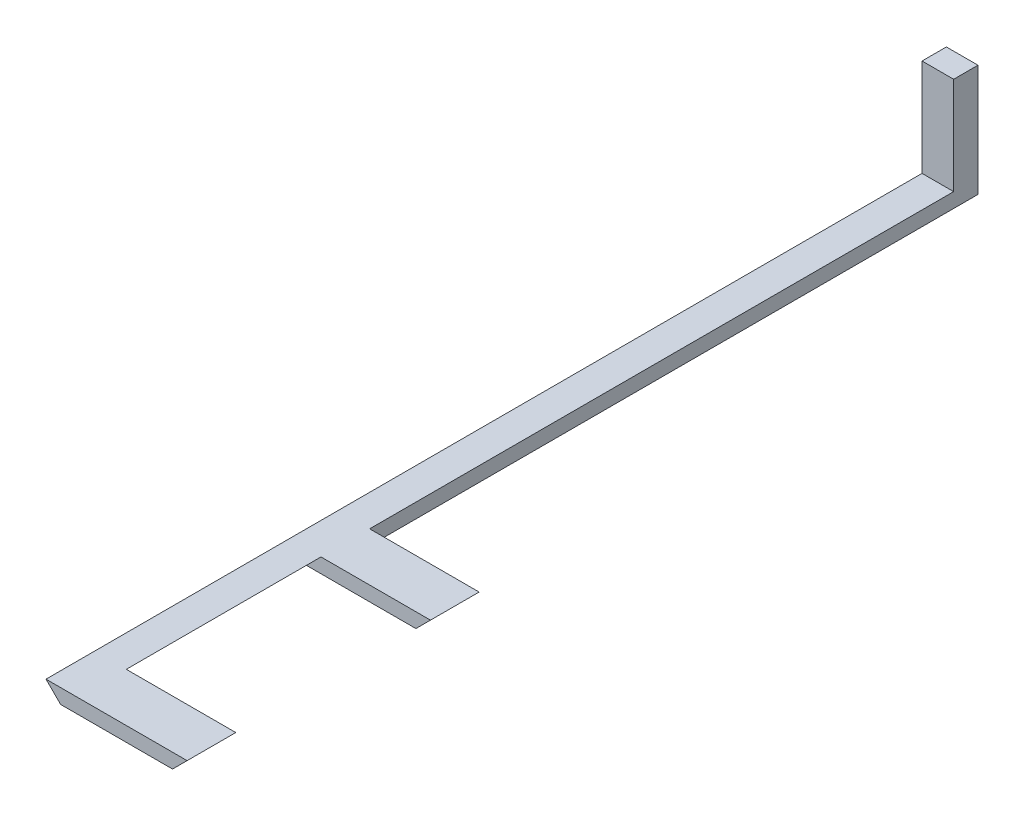
ISO-10303-21;
HEADER;
FILE_DESCRIPTION(('STEP AP214'),'2;1');
FILE_NAME('part.step','',(''),(''),'','','');
FILE_SCHEMA(('AUTOMOTIVE_DESIGN { 1 0 10303 214 1 1 1 1 }'));
ENDSEC;
DATA;
#1=APPLICATION_CONTEXT('core data for automotive mechanical design processes');
#2=APPLICATION_PROTOCOL_DEFINITION('international standard','automotive_design',2000,#1);
#3=PRODUCT_CONTEXT('',#1,'mechanical');
#4=PRODUCT('Part','Part','',(#3));
#5=PRODUCT_RELATED_PRODUCT_CATEGORY('part','',(#4));
#6=PRODUCT_DEFINITION_FORMATION('','',#4);
#7=PRODUCT_DEFINITION_CONTEXT('part definition',#1,'design');
#8=PRODUCT_DEFINITION('design','',#6,#7);
#9=PRODUCT_DEFINITION_SHAPE('','',#8);
#10=(LENGTH_UNIT() NAMED_UNIT(*) SI_UNIT(.MILLI.,.METRE.));
#11=(NAMED_UNIT(*) PLANE_ANGLE_UNIT() SI_UNIT($,.RADIAN.));
#12=(NAMED_UNIT(*) SI_UNIT($,.STERADIAN.) SOLID_ANGLE_UNIT());
#13=UNCERTAINTY_MEASURE_WITH_UNIT(LENGTH_MEASURE(1.E-05),#10,'distance_accuracy_value','');
#14=(GEOMETRIC_REPRESENTATION_CONTEXT(3) GLOBAL_UNCERTAINTY_ASSIGNED_CONTEXT((#13)) GLOBAL_UNIT_ASSIGNED_CONTEXT((#10,
#11,#12)) REPRESENTATION_CONTEXT('',''));
#15=CARTESIAN_POINT('',(0.,0.,0.));
#16=DIRECTION('',(0.,0.,1.));
#17=DIRECTION('',(1.,0.,0.));
#18=AXIS2_PLACEMENT_3D('',#15,#16,#17);
#19=CARTESIAN_POINT('',(0.,3.,0.));
#20=DIRECTION('',(0.,0.,-1.));
#21=DIRECTION('',(-1.,0.,0.));
#22=AXIS2_PLACEMENT_3D('',#19,#20,#21);
#23=PLANE('',#22);
#24=DIRECTION('',(1.,0.,0.));
#25=VECTOR('',#24,1.);
#26=CARTESIAN_POINT('',(0.,3.,0.));
#27=LINE('',#26,#25);
#28=CARTESIAN_POINT('',(-6.49999999999999,3.,0.));
#29=VERTEX_POINT('',#28);
#30=CARTESIAN_POINT('',(22.5,3.,0.));
#31=VERTEX_POINT('',#30);
#32=EDGE_CURVE('E175',#29,#31,#27,.T.);
#33=ORIENTED_EDGE('',*,*,#32,.F.);
#34=DIRECTION('',(-0.707106781186548,0.707106781186548,0.));
#35=VECTOR('',#34,1.);
#36=CARTESIAN_POINT('',(-6.49999999999991,2.99999999999992,0.));
#37=LINE('',#36,#35);
#38=CARTESIAN_POINT('',(-3.49999999999999,0.,0.));
#39=VERTEX_POINT('',#38);
#40=EDGE_CURVE('E240',#29,#39,#37,.F.);
#41=ORIENTED_EDGE('',*,*,#40,.T.);
#42=DIRECTION('',(1.,0.,0.));
#43=VECTOR('',#42,1.);
#44=CARTESIAN_POINT('',(0.,0.,0.));
#45=LINE('',#44,#43);
#46=CARTESIAN_POINT('',(19.5,0.,0.));
#47=VERTEX_POINT('',#46);
#48=EDGE_CURVE('E168',#39,#47,#45,.T.);
#49=ORIENTED_EDGE('',*,*,#48,.T.);
#50=DIRECTION('',(-0.707106781186548,-0.707106781186548,0.));
#51=VECTOR('',#50,1.);
#52=CARTESIAN_POINT('',(22.5,3.,0.));
#53=LINE('',#52,#51);
#54=EDGE_CURVE('E233',#47,#31,#53,.F.);
#55=ORIENTED_EDGE('',*,*,#54,.T.);
#56=EDGE_LOOP('',(#33,#41,#49,#55));
#57=FACE_BOUND('',#56,.T.);
#58=ADVANCED_FACE('F47',(#57),#23,.F.);
#59=CARTESIAN_POINT('',(0.,3.,-10.));
#60=DIRECTION('',(0.,0.,1.));
#61=DIRECTION('',(1.,0.,0.));
#62=AXIS2_PLACEMENT_3D('',#59,#60,#61);
#63=PLANE('',#62);
#64=DIRECTION('',(-1.,0.,0.));
#65=VECTOR('',#64,1.);
#66=CARTESIAN_POINT('',(0.,3.,-10.));
#67=LINE('',#66,#65);
#68=CARTESIAN_POINT('',(22.5,3.,-10.));
#69=VERTEX_POINT('',#68);
#70=CARTESIAN_POINT('',(0.,3.,-10.));
#71=VERTEX_POINT('',#70);
#72=EDGE_CURVE('E181',#69,#71,#67,.T.);
#73=ORIENTED_EDGE('',*,*,#72,.F.);
#74=DIRECTION('',(0.707106781186548,0.707106781186548,0.));
#75=VECTOR('',#74,1.);
#76=CARTESIAN_POINT('',(22.5,3.,-10.));
#77=LINE('',#76,#75);
#78=CARTESIAN_POINT('',(19.5,0.,-10.));
#79=VERTEX_POINT('',#78);
#80=EDGE_CURVE('E231',#69,#79,#77,.F.);
#81=ORIENTED_EDGE('',*,*,#80,.T.);
#82=DIRECTION('',(-1.,0.,0.));
#83=VECTOR('',#82,1.);
#84=CARTESIAN_POINT('',(0.,0.,-10.));
#85=LINE('',#84,#83);
#86=CARTESIAN_POINT('',(-3.,0.,-10.));
#87=VERTEX_POINT('',#86);
#88=EDGE_CURVE('E170',#79,#87,#85,.T.);
#89=ORIENTED_EDGE('',*,*,#88,.T.);
#90=DIRECTION('',(-0.707106781186548,-0.707106781186548,0.));
#91=VECTOR('',#90,1.);
#92=CARTESIAN_POINT('',(0.,3.,-10.));
#93=LINE('',#92,#91);
#94=EDGE_CURVE('E238',#87,#71,#93,.F.);
#95=ORIENTED_EDGE('',*,*,#94,.T.);
#96=EDGE_LOOP('',(#73,#81,#89,#95));
#97=FACE_BOUND('',#96,.T.);
#98=ADVANCED_FACE('F268',(#97),#63,.F.);
#99=CARTESIAN_POINT('',(-1.71512449944288E-13,3.,-50.));
#100=DIRECTION('',(0.,0.,-1.));
#101=DIRECTION('',(-1.,0.,0.));
#102=AXIS2_PLACEMENT_3D('',#99,#100,#101);
#103=PLANE('',#102);
#104=DIRECTION('',(1.,0.,0.));
#105=VECTOR('',#104,1.);
#106=CARTESIAN_POINT('',(-1.71512449944288E-13,0.,-50.));
#107=LINE('',#106,#105);
#108=CARTESIAN_POINT('',(-3.00000000000017,0.,-50.));
#109=VERTEX_POINT('',#108);
#110=CARTESIAN_POINT('',(19.4999999999998,0.,-50.));
#111=VERTEX_POINT('',#110);
#112=EDGE_CURVE('E201',#109,#111,#107,.T.);
#113=ORIENTED_EDGE('',*,*,#112,.T.);
#114=DIRECTION('',(-0.707106781186548,-0.707106781186548,0.));
#115=VECTOR('',#114,1.);
#116=CARTESIAN_POINT('',(22.4999999999998,3.,-50.));
#117=LINE('',#116,#115);
#118=CARTESIAN_POINT('',(22.4999999999998,3.,-50.));
#119=VERTEX_POINT('',#118);
#120=EDGE_CURVE('E229',#111,#119,#117,.F.);
#121=ORIENTED_EDGE('',*,*,#120,.T.);
#122=DIRECTION('',(1.,0.,0.));
#123=VECTOR('',#122,1.);
#124=CARTESIAN_POINT('',(-1.71512449944288E-13,3.,-50.));
#125=LINE('',#124,#123);
#126=CARTESIAN_POINT('',(-1.71512449944288E-13,3.,-50.));
#127=VERTEX_POINT('',#126);
#128=EDGE_CURVE('E187',#127,#119,#125,.T.);
#129=ORIENTED_EDGE('',*,*,#128,.F.);
#130=DIRECTION('',(0.707106781186548,0.707106781186548,0.));
#131=VECTOR('',#130,1.);
#132=CARTESIAN_POINT('',(-1.72813492551271E-13,3.,-50.));
#133=LINE('',#132,#131);
#134=EDGE_CURVE('E235',#127,#109,#133,.F.);
#135=ORIENTED_EDGE('',*,*,#134,.T.);
#136=EDGE_LOOP('',(#113,#121,#129,#135));
#137=FACE_BOUND('',#136,.T.);
#138=ADVANCED_FACE('F277',(#137),#103,.F.);
#139=CARTESIAN_POINT('',(-1.71512449944288E-13,3.,-60.));
#140=DIRECTION('',(0.,0.,1.));
#141=DIRECTION('',(1.,0.,0.));
#142=AXIS2_PLACEMENT_3D('',#139,#140,#141);
#143=PLANE('',#142);
#144=DIRECTION('',(-1.,0.,0.));
#145=VECTOR('',#144,1.);
#146=CARTESIAN_POINT('',(-1.71512449944288E-13,3.,-60.));
#147=LINE('',#146,#145);
#148=CARTESIAN_POINT('',(22.4999999999998,3.,-60.));
#149=VERTEX_POINT('',#148);
#150=CARTESIAN_POINT('',(-1.71512449944288E-13,3.,-60.));
#151=VERTEX_POINT('',#150);
#152=EDGE_CURVE('E193',#149,#151,#147,.T.);
#153=ORIENTED_EDGE('',*,*,#152,.F.);
#154=DIRECTION('',(0.707106781186548,0.707106781186548,0.));
#155=VECTOR('',#154,1.);
#156=CARTESIAN_POINT('',(22.4999999999998,3.,-60.));
#157=LINE('',#156,#155);
#158=CARTESIAN_POINT('',(19.4999999999998,0.,-60.));
#159=VERTEX_POINT('',#158);
#160=EDGE_CURVE('E227',#149,#159,#157,.F.);
#161=ORIENTED_EDGE('',*,*,#160,.T.);
#162=DIRECTION('',(-1.,0.,0.));
#163=VECTOR('',#162,1.);
#164=CARTESIAN_POINT('',(-1.71512449944288E-13,0.,-60.));
#165=LINE('',#164,#163);
#166=CARTESIAN_POINT('',(-1.71512449944288E-13,0.,-60.));
#167=VERTEX_POINT('',#166);
#168=EDGE_CURVE('E204',#159,#167,#165,.T.);
#169=ORIENTED_EDGE('',*,*,#168,.T.);
#170=DIRECTION('',(0.,-1.,0.));
#171=VECTOR('',#170,1.);
#172=CARTESIAN_POINT('',(-1.71512449944288E-13,3.,-60.));
#173=LINE('',#172,#171);
#174=EDGE_CURVE('E216',#151,#167,#173,.T.);
#175=ORIENTED_EDGE('',*,*,#174,.F.);
#176=EDGE_LOOP('',(#153,#161,#169,#175));
#177=FACE_BOUND('',#176,.T.);
#178=ADVANCED_FACE('F285',(#177),#143,.F.);
#179=CARTESIAN_POINT('',(-1.71512449944288E-13,3.,-60.));
#180=DIRECTION('',(-1.,0.,0.));
#181=DIRECTION('',(0.,0.,1.));
#182=AXIS2_PLACEMENT_3D('',#179,#180,#181);
#183=PLANE('',#182);
#184=DIRECTION('',(0.,0.,-1.));
#185=VECTOR('',#184,1.);
#186=CARTESIAN_POINT('',(-1.71512449944288E-13,0.,-60.));
#187=LINE('',#186,#185);
#188=CARTESIAN_POINT('',(-1.66613862747699E-13,0.,-185.));
#189=VERTEX_POINT('',#188);
#190=EDGE_CURVE('E206',#167,#189,#187,.T.);
#191=ORIENTED_EDGE('',*,*,#190,.T.);
#192=DIRECTION('',(0.,-1.,0.));
#193=VECTOR('',#192,1.);
#194=CARTESIAN_POINT('',(-1.66613862747699E-13,3.,-185.));
#195=LINE('',#194,#193);
#196=CARTESIAN_POINT('',(-1.72604985859692E-13,23.,-185.));
#197=VERTEX_POINT('',#196);
#198=EDGE_CURVE('E213',#197,#189,#195,.T.);
#199=ORIENTED_EDGE('',*,*,#198,.F.);
#200=DIRECTION('',(0.,0.,-1.));
#201=VECTOR('',#200,1.);
#202=CARTESIAN_POINT('',(-1.72604985859692E-13,23.,-185.));
#203=LINE('',#202,#201);
#204=CARTESIAN_POINT('',(-1.72604985859692E-13,23.,-180.));
#205=VERTEX_POINT('',#204);
#206=EDGE_CURVE('E157',#205,#197,#203,.T.);
#207=ORIENTED_EDGE('',*,*,#206,.F.);
#208=DIRECTION('',(0.,-1.,0.));
#209=VECTOR('',#208,1.);
#210=CARTESIAN_POINT('',(-1.72604985859692E-13,23.,-180.));
#211=LINE('',#210,#209);
#212=CARTESIAN_POINT('',(-1.72604985859692E-13,3.,-180.));
#213=VERTEX_POINT('',#212);
#214=EDGE_CURVE('E153',#205,#213,#211,.T.);
#215=ORIENTED_EDGE('',*,*,#214,.T.);
#216=DIRECTION('',(0.,0.,-1.));
#217=VECTOR('',#216,1.);
#218=CARTESIAN_POINT('',(-1.71512449944288E-13,3.,-60.));
#219=LINE('',#218,#217);
#220=EDGE_CURVE('E195',#151,#213,#219,.T.);
#221=ORIENTED_EDGE('',*,*,#220,.F.);
#222=ORIENTED_EDGE('',*,*,#174,.T.);
#223=EDGE_LOOP('',(#191,#199,#207,#215,#221,#222));
#224=FACE_BOUND('',#223,.T.);
#225=ADVANCED_FACE('F290',(#224),#183,.F.);
#226=CARTESIAN_POINT('',(-6.49999999999987,3.,-185.));
#227=DIRECTION('',(0.,0.,1.));
#228=DIRECTION('',(1.,0.,0.));
#229=AXIS2_PLACEMENT_3D('',#226,#227,#228);
#230=PLANE('',#229);
#231=DIRECTION('',(-1.,0.,0.));
#232=VECTOR('',#231,1.);
#233=CARTESIAN_POINT('',(-6.49999999999987,0.,-185.));
#234=LINE('',#233,#232);
#235=CARTESIAN_POINT('',(-6.49999999999987,0.,-185.));
#236=VERTEX_POINT('',#235);
#237=EDGE_CURVE('E208',#189,#236,#234,.T.);
#238=ORIENTED_EDGE('',*,*,#237,.T.);
#239=DIRECTION('',(0.,-1.,0.));
#240=VECTOR('',#239,1.);
#241=CARTESIAN_POINT('',(-6.49999999999987,3.,-185.));
#242=LINE('',#241,#240);
#243=CARTESIAN_POINT('',(-6.49999999999987,23.,-185.));
#244=VERTEX_POINT('',#243);
#245=EDGE_CURVE('E198',#244,#236,#242,.T.);
#246=ORIENTED_EDGE('',*,*,#245,.F.);
#247=DIRECTION('',(-1.,0.,0.));
#248=VECTOR('',#247,1.);
#249=CARTESIAN_POINT('',(-6.49999999999987,23.,-185.));
#250=LINE('',#249,#248);
#251=EDGE_CURVE('E164',#197,#244,#250,.T.);
#252=ORIENTED_EDGE('',*,*,#251,.F.);
#253=ORIENTED_EDGE('',*,*,#198,.T.);
#254=EDGE_LOOP('',(#238,#246,#252,#253));
#255=FACE_BOUND('',#254,.T.);
#256=ADVANCED_FACE('F294',(#255),#230,.F.);
#257=CARTESIAN_POINT('',(-6.49999999999983,3.,-60.));
#258=DIRECTION('',(1.,0.,0.));
#259=DIRECTION('',(0.,0.,-1.));
#260=AXIS2_PLACEMENT_3D('',#257,#258,#259);
#261=PLANE('',#260);
#262=DIRECTION('',(0.,0.,1.));
#263=VECTOR('',#262,1.);
#264=CARTESIAN_POINT('',(-6.49999999999983,0.,-60.));
#265=LINE('',#264,#263);
#266=CARTESIAN_POINT('',(-6.49999999999986,0.,-49.1213203435595));
#267=VERTEX_POINT('',#266);
#268=EDGE_CURVE('E63',#236,#267,#265,.T.);
#269=ORIENTED_EDGE('',*,*,#268,.T.);
#270=DIRECTION('',(0.,0.816496580927728,0.577350269189623));
#271=VECTOR('',#270,1.);
#272=CARTESIAN_POINT('',(-6.49999999999986,-3.12825877028344,-51.3333333333332));
#273=LINE('',#272,#271);
#274=CARTESIAN_POINT('',(-6.49999999999983,3.,-46.9999999999999));
#275=VERTEX_POINT('',#274);
#276=EDGE_CURVE('E56',#267,#275,#273,.T.);
#277=ORIENTED_EDGE('',*,*,#276,.T.);
#278=DIRECTION('',(0.,0.,1.));
#279=VECTOR('',#278,1.);
#280=CARTESIAN_POINT('',(-6.49999999999983,3.,-60.));
#281=LINE('',#280,#279);
#282=CARTESIAN_POINT('',(-6.49999999999987,3.,-180.));
#283=VERTEX_POINT('',#282);
#284=EDGE_CURVE('E70',#283,#275,#281,.T.);
#285=ORIENTED_EDGE('',*,*,#284,.F.);
#286=DIRECTION('',(0.,-1.,0.));
#287=VECTOR('',#286,1.);
#288=CARTESIAN_POINT('',(-6.49999999999987,23.,-180.));
#289=LINE('',#288,#287);
#290=CARTESIAN_POINT('',(-6.49999999999987,23.,-180.));
#291=VERTEX_POINT('',#290);
#292=EDGE_CURVE('E151',#291,#283,#289,.T.);
#293=ORIENTED_EDGE('',*,*,#292,.F.);
#294=DIRECTION('',(0.,0.,1.));
#295=VECTOR('',#294,1.);
#296=CARTESIAN_POINT('',(-6.49999999999987,23.,-185.));
#297=LINE('',#296,#295);
#298=EDGE_CURVE('E158',#244,#291,#297,.T.);
#299=ORIENTED_EDGE('',*,*,#298,.F.);
#300=ORIENTED_EDGE('',*,*,#245,.T.);
#301=EDGE_LOOP('',(#269,#277,#285,#293,#299,#300));
#302=FACE_BOUND('',#301,.T.);
#303=ADVANCED_FACE('F167',(#302),#261,.F.);
#304=CARTESIAN_POINT('',(0.,3.,0.));
#305=DIRECTION('',(0.,1.,0.));
#306=DIRECTION('',(0.,0.,1.));
#307=AXIS2_PLACEMENT_3D('',#304,#305,#306);
#308=PLANE('',#307);
#309=DIRECTION('',(1.,0.,0.));
#310=VECTOR('',#309,1.);
#311=CARTESIAN_POINT('',(-6.49999999999987,3.,-180.));
#312=LINE('',#311,#310);
#313=EDGE_CURVE('E165',#283,#213,#312,.T.);
#314=ORIENTED_EDGE('',*,*,#313,.F.);
#315=ORIENTED_EDGE('',*,*,#284,.T.);
#316=EDGE_CURVE('E197',#275,#29,#281,.T.);
#317=ORIENTED_EDGE('',*,*,#316,.T.);
#318=ORIENTED_EDGE('',*,*,#32,.T.);
#319=DIRECTION('',(0.,0.,-1.));
#320=VECTOR('',#319,1.);
#321=CARTESIAN_POINT('',(22.5,3.,0.));
#322=LINE('',#321,#320);
#323=EDGE_CURVE('E178',#31,#69,#322,.T.);
#324=ORIENTED_EDGE('',*,*,#323,.T.);
#325=ORIENTED_EDGE('',*,*,#72,.T.);
#326=DIRECTION('',(0.,0.,-1.));
#327=VECTOR('',#326,1.);
#328=CARTESIAN_POINT('',(-1.71512449944288E-13,3.,-50.));
#329=LINE('',#328,#327);
#330=EDGE_CURVE('E184',#71,#127,#329,.T.);
#331=ORIENTED_EDGE('',*,*,#330,.T.);
#332=ORIENTED_EDGE('',*,*,#128,.T.);
#333=DIRECTION('',(0.,0.,-1.));
#334=VECTOR('',#333,1.);
#335=CARTESIAN_POINT('',(22.4999999999998,3.,-50.));
#336=LINE('',#335,#334);
#337=EDGE_CURVE('E190',#119,#149,#336,.T.);
#338=ORIENTED_EDGE('',*,*,#337,.T.);
#339=ORIENTED_EDGE('',*,*,#152,.T.);
#340=ORIENTED_EDGE('',*,*,#220,.T.);
#341=EDGE_LOOP('',(#314,#315,#317,#318,#324,#325,#331,#332,#338,#339,#340));
#342=FACE_BOUND('',#341,.T.);
#343=ADVANCED_FACE('F263',(#342),#308,.T.);
#344=CARTESIAN_POINT('',(0.,0.,0.));
#345=DIRECTION('',(0.,1.,0.));
#346=DIRECTION('',(0.,0.,1.));
#347=AXIS2_PLACEMENT_3D('',#344,#345,#346);
#348=PLANE('',#347);
#349=ORIENTED_EDGE('',*,*,#48,.F.);
#350=DIRECTION('',(0.,0.,-1.));
#351=VECTOR('',#350,1.);
#352=CARTESIAN_POINT('',(-3.49999999999999,0.,0.));
#353=LINE('',#352,#351);
#354=CARTESIAN_POINT('',(-3.49999999999987,0.,-46.9999999999999));
#355=VERTEX_POINT('',#354);
#356=EDGE_CURVE('E242',#39,#355,#353,.T.);
#357=ORIENTED_EDGE('',*,*,#356,.T.);
#358=DIRECTION('',(-0.816496580927727,0.,-0.577350269189625));
#359=VECTOR('',#358,1.);
#360=CARTESIAN_POINT('',(20.9893458105118,0.,-29.6834175105648));
#361=LINE('',#360,#359);
#362=EDGE_CURVE('E13',#355,#267,#361,.T.);
#363=ORIENTED_EDGE('',*,*,#362,.T.);
#364=ORIENTED_EDGE('',*,*,#268,.F.);
#365=ORIENTED_EDGE('',*,*,#237,.F.);
#366=ORIENTED_EDGE('',*,*,#190,.F.);
#367=ORIENTED_EDGE('',*,*,#168,.F.);
#368=DIRECTION('',(0.,0.,1.));
#369=VECTOR('',#368,1.);
#370=CARTESIAN_POINT('',(19.4999999999998,0.,0.));
#371=LINE('',#370,#369);
#372=EDGE_CURVE('E222',#159,#111,#371,.T.);
#373=ORIENTED_EDGE('',*,*,#372,.T.);
#374=ORIENTED_EDGE('',*,*,#112,.F.);
#375=DIRECTION('',(0.,0.,1.));
#376=VECTOR('',#375,1.);
#377=CARTESIAN_POINT('',(-2.99999999999996,0.,0.));
#378=LINE('',#377,#376);
#379=EDGE_CURVE('E224',#109,#87,#378,.T.);
#380=ORIENTED_EDGE('',*,*,#379,.T.);
#381=ORIENTED_EDGE('',*,*,#88,.F.);
#382=DIRECTION('',(0.,0.,1.));
#383=VECTOR('',#382,1.);
#384=CARTESIAN_POINT('',(19.5,0.,0.));
#385=LINE('',#384,#383);
#386=EDGE_CURVE('E219',#79,#47,#385,.T.);
#387=ORIENTED_EDGE('',*,*,#386,.T.);
#388=EDGE_LOOP('',(#349,#357,#363,#364,#365,#366,#367,#373,#374,#380,#381,#387));
#389=FACE_BOUND('',#388,.T.);
#390=ADVANCED_FACE('F256',(#389),#348,.F.);
#391=CARTESIAN_POINT('',(-1.71512449944288E-13,3.,-50.));
#392=DIRECTION('',(-0.707106781186547,0.707106781186547,0.));
#393=DIRECTION('',(0.,0.,-1.));
#394=AXIS2_PLACEMENT_3D('',#391,#392,#393);
#395=PLANE('',#394);
#396=ORIENTED_EDGE('',*,*,#94,.F.);
#397=ORIENTED_EDGE('',*,*,#379,.F.);
#398=ORIENTED_EDGE('',*,*,#134,.F.);
#399=ORIENTED_EDGE('',*,*,#330,.F.);
#400=EDGE_LOOP('',(#396,#397,#398,#399));
#401=FACE_BOUND('',#400,.T.);
#402=ADVANCED_FACE('F273',(#401),#395,.F.);
#403=CARTESIAN_POINT('',(22.4999999999998,3.,-50.));
#404=DIRECTION('',(-0.707106781186547,0.707106781186547,0.));
#405=DIRECTION('',(0.,0.,-1.));
#406=AXIS2_PLACEMENT_3D('',#403,#404,#405);
#407=PLANE('',#406);
#408=ORIENTED_EDGE('',*,*,#120,.F.);
#409=ORIENTED_EDGE('',*,*,#372,.F.);
#410=ORIENTED_EDGE('',*,*,#160,.F.);
#411=ORIENTED_EDGE('',*,*,#337,.F.);
#412=EDGE_LOOP('',(#408,#409,#410,#411));
#413=FACE_BOUND('',#412,.T.);
#414=ADVANCED_FACE('F281',(#413),#407,.F.);
#415=CARTESIAN_POINT('',(22.5,3.,0.));
#416=DIRECTION('',(-0.707106781186547,0.707106781186547,0.));
#417=DIRECTION('',(0.,0.,-1.));
#418=AXIS2_PLACEMENT_3D('',#415,#416,#417);
#419=PLANE('',#418);
#420=ORIENTED_EDGE('',*,*,#54,.F.);
#421=ORIENTED_EDGE('',*,*,#386,.F.);
#422=ORIENTED_EDGE('',*,*,#80,.F.);
#423=ORIENTED_EDGE('',*,*,#323,.F.);
#424=EDGE_LOOP('',(#420,#421,#422,#423));
#425=FACE_BOUND('',#424,.T.);
#426=ADVANCED_FACE('F266',(#425),#419,.F.);
#427=CARTESIAN_POINT('',(-6.49999999999987,23.,-180.));
#428=DIRECTION('',(0.,0.,-1.));
#429=DIRECTION('',(-1.,0.,0.));
#430=AXIS2_PLACEMENT_3D('',#427,#428,#429);
#431=PLANE('',#430);
#432=ORIENTED_EDGE('',*,*,#313,.T.);
#433=ORIENTED_EDGE('',*,*,#214,.F.);
#434=DIRECTION('',(1.,0.,0.));
#435=VECTOR('',#434,1.);
#436=CARTESIAN_POINT('',(-6.49999999999987,23.,-180.));
#437=LINE('',#436,#435);
#438=EDGE_CURVE('E146',#291,#205,#437,.T.);
#439=ORIENTED_EDGE('',*,*,#438,.F.);
#440=ORIENTED_EDGE('',*,*,#292,.T.);
#441=EDGE_LOOP('',(#432,#433,#439,#440));
#442=FACE_BOUND('',#441,.T.);
#443=ADVANCED_FACE('F149',(#442),#431,.F.);
#444=CARTESIAN_POINT('',(0.,23.,0.));
#445=DIRECTION('',(0.,1.,0.));
#446=DIRECTION('',(0.,0.,1.));
#447=AXIS2_PLACEMENT_3D('',#444,#445,#446);
#448=PLANE('',#447);
#449=ORIENTED_EDGE('',*,*,#298,.T.);
#450=ORIENTED_EDGE('',*,*,#438,.T.);
#451=ORIENTED_EDGE('',*,*,#206,.T.);
#452=ORIENTED_EDGE('',*,*,#251,.T.);
#453=EDGE_LOOP('',(#449,#450,#451,#452));
#454=FACE_BOUND('',#453,.T.);
#455=ADVANCED_FACE('F162',(#454),#448,.T.);
#456=CARTESIAN_POINT('',(-6.49999999999983,3.,-60.));
#457=DIRECTION('',(0.707106781186548,0.707106781186548,0.));
#458=DIRECTION('',(0.,0.,1.));
#459=AXIS2_PLACEMENT_3D('',#456,#457,#458);
#460=PLANE('',#459);
#461=ORIENTED_EDGE('',*,*,#316,.F.);
#462=DIRECTION('',(-0.707106781186548,0.707106781186548,0.));
#463=VECTOR('',#462,1.);
#464=CARTESIAN_POINT('',(-3.49999999999987,0.,-46.9999999999999));
#465=LINE('',#464,#463);
#466=EDGE_CURVE('E245',#275,#355,#465,.F.);
#467=ORIENTED_EDGE('',*,*,#466,.T.);
#468=ORIENTED_EDGE('',*,*,#356,.F.);
#469=ORIENTED_EDGE('',*,*,#40,.F.);
#470=EDGE_LOOP('',(#461,#467,#468,#469));
#471=FACE_BOUND('',#470,.T.);
#472=ADVANCED_FACE('F252',(#471),#460,.F.);
#473=CARTESIAN_POINT('',(-7.12132034355954,-0.62132034355968,-49.9999999999999));
#474=DIRECTION('',(0.5,0.499999999999998,-0.707106781186549));
#475=DIRECTION('',(-0.707106781186548,0.707106781186548,0.));
#476=AXIS2_PLACEMENT_3D('',#473,#474,#475);
#477=PLANE('',#476);
#478=ORIENTED_EDGE('',*,*,#362,.F.);
#479=ORIENTED_EDGE('',*,*,#466,.F.);
#480=ORIENTED_EDGE('',*,*,#276,.F.);
#481=EDGE_LOOP('',(#478,#479,#480));
#482=FACE_BOUND('',#481,.T.);
#483=ADVANCED_FACE('F50',(#482),#477,.F.);
#484=CLOSED_SHELL('',(#58,#98,#138,#178,#225,#256,#303,#343,#390,#402,#414,#426,#443,#455,#472,#483));
#485=MANIFOLD_SOLID_BREP('B2',#484);
#486=ADVANCED_BREP_SHAPE_REPRESENTATION('',(#18,#485),#14);
#487=SHAPE_DEFINITION_REPRESENTATION(#9,#486);
ENDSEC;
END-ISO-10303-21;
